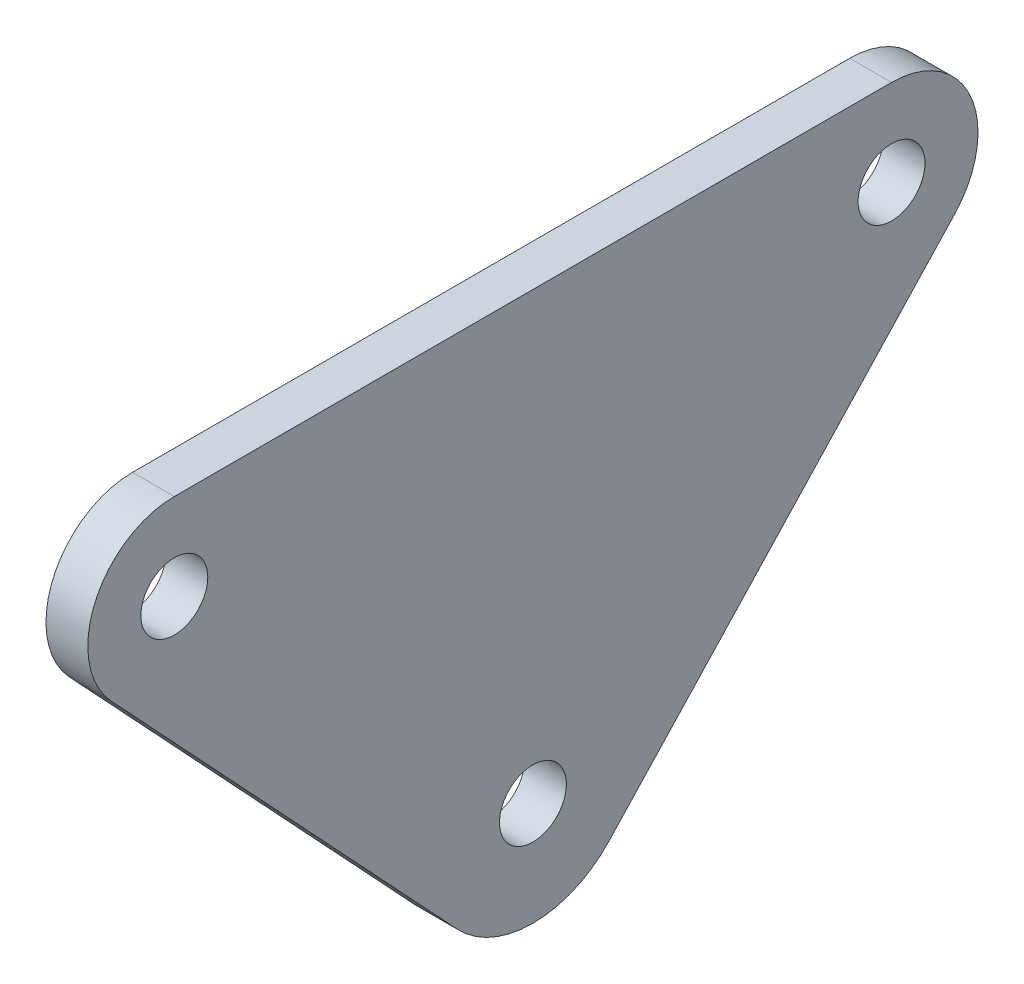
ISO-10303-21;
HEADER;
FILE_DESCRIPTION(('STEP AP214'),'2;1');
FILE_NAME('part.step','',(''),(''),'','','');
FILE_SCHEMA(('AUTOMOTIVE_DESIGN { 1 0 10303 214 1 1 1 1 }'));
ENDSEC;
DATA;
#1=APPLICATION_CONTEXT('core data for automotive mechanical design processes');
#2=APPLICATION_PROTOCOL_DEFINITION('international standard','automotive_design',2000,#1);
#3=PRODUCT_CONTEXT('',#1,'mechanical');
#4=PRODUCT('Part','Part','',(#3));
#5=PRODUCT_RELATED_PRODUCT_CATEGORY('part','',(#4));
#6=PRODUCT_DEFINITION_FORMATION('','',#4);
#7=PRODUCT_DEFINITION_CONTEXT('part definition',#1,'design');
#8=PRODUCT_DEFINITION('design','',#6,#7);
#9=PRODUCT_DEFINITION_SHAPE('','',#8);
#10=(LENGTH_UNIT() NAMED_UNIT(*) SI_UNIT(.MILLI.,.METRE.));
#11=(NAMED_UNIT(*) PLANE_ANGLE_UNIT() SI_UNIT($,.RADIAN.));
#12=(NAMED_UNIT(*) SI_UNIT($,.STERADIAN.) SOLID_ANGLE_UNIT());
#13=UNCERTAINTY_MEASURE_WITH_UNIT(LENGTH_MEASURE(1.E-05),#10,'distance_accuracy_value','');
#14=(GEOMETRIC_REPRESENTATION_CONTEXT(3) GLOBAL_UNCERTAINTY_ASSIGNED_CONTEXT((#13)) GLOBAL_UNIT_ASSIGNED_CONTEXT((#10,
#11,#12)) REPRESENTATION_CONTEXT('',''));
#15=CARTESIAN_POINT('',(0.,0.,0.));
#16=DIRECTION('',(0.,0.,1.));
#17=DIRECTION('',(1.,0.,0.));
#18=AXIS2_PLACEMENT_3D('',#15,#16,#17);
#19=CARTESIAN_POINT('',(4.445,38.1,38.1));
#20=DIRECTION('',(1.,0.,0.));
#21=DIRECTION('',(0.,0.,-1.));
#22=AXIS2_PLACEMENT_3D('',#19,#20,#21);
#23=PLANE('',#22);
#24=CARTESIAN_POINT('',(4.445,0.,0.));
#25=DIRECTION('',(1.,0.,0.));
#26=DIRECTION('',(0.,0.,-1.));
#27=AXIS2_PLACEMENT_3D('',#24,#25,#26);
#28=CIRCLE('',#27,3.556);
#29=CARTESIAN_POINT('',(4.445,0.,-3.556));
#30=VERTEX_POINT('',#29);
#31=EDGE_CURVE('E215',#30,#30,#28,.T.);
#32=ORIENTED_EDGE('',*,*,#31,.F.);
#33=EDGE_LOOP('',(#32));
#34=FACE_BOUND('',#33,.T.);
#35=CARTESIAN_POINT('',(4.445,38.1,38.1));
#36=DIRECTION('',(1.,0.,0.));
#37=DIRECTION('',(0.,0.,-1.));
#38=AXIS2_PLACEMENT_3D('',#35,#36,#37);
#39=CIRCLE('',#38,9.18880564338449);
#40=CARTESIAN_POINT('',(4.445,47.2888056433845,38.1));
#41=VERTEX_POINT('',#40);
#42=CARTESIAN_POINT('',(4.445,31.8284133518365,44.8157538717907));
#43=VERTEX_POINT('',#42);
#44=EDGE_CURVE('E154',#41,#43,#39,.T.);
#45=ORIENTED_EDGE('',*,*,#44,.T.);
#46=DIRECTION('',(0.,-0.730862544320514,-0.682524681831613));
#47=VECTOR('',#46,1.);
#48=CARTESIAN_POINT('',(4.445,-7.52857362678007,8.06176336540207));
#49=LINE('',#48,#47);
#50=CARTESIAN_POINT('',(4.445,-7.52857362678007,8.06176336540207));
#51=VERTEX_POINT('',#50);
#52=EDGE_CURVE('E102',#43,#51,#49,.T.);
#53=ORIENTED_EDGE('',*,*,#52,.T.);
#54=CARTESIAN_POINT('',(4.445,0.,0.));
#55=DIRECTION('',(1.,0.,0.));
#56=DIRECTION('',(0.,0.,1.));
#57=AXIS2_PLACEMENT_3D('',#54,#55,#56);
#58=CIRCLE('',#57,11.0304782042116);
#59=CARTESIAN_POINT('',(4.445,-7.52857362678006,-8.06176336540207));
#60=VERTEX_POINT('',#59);
#61=EDGE_CURVE('E115',#51,#60,#58,.T.);
#62=ORIENTED_EDGE('',*,*,#61,.T.);
#63=DIRECTION('',(0.,0.730862544320514,-0.682524681831613));
#64=VECTOR('',#63,1.);
#65=CARTESIAN_POINT('',(4.445,31.8284133518365,-44.8157538717907));
#66=LINE('',#65,#64);
#67=CARTESIAN_POINT('',(4.445,31.8284133518365,-44.8157538717907));
#68=VERTEX_POINT('',#67);
#69=EDGE_CURVE('E109',#60,#68,#66,.T.);
#70=ORIENTED_EDGE('',*,*,#69,.T.);
#71=CARTESIAN_POINT('',(4.445,38.1,-38.1));
#72=DIRECTION('',(1.,0.,0.));
#73=DIRECTION('',(0.,0.,1.));
#74=AXIS2_PLACEMENT_3D('',#71,#72,#73);
#75=CIRCLE('',#74,9.18880564338449);
#76=CARTESIAN_POINT('',(4.445,47.2888056433845,-38.1));
#77=VERTEX_POINT('',#76);
#78=EDGE_CURVE('E113',#68,#77,#75,.T.);
#79=ORIENTED_EDGE('',*,*,#78,.T.);
#80=DIRECTION('',(0.,0.,1.));
#81=VECTOR('',#80,1.);
#82=CARTESIAN_POINT('',(4.445,47.2888056433845,38.1));
#83=LINE('',#82,#81);
#84=EDGE_CURVE('E65',#77,#41,#83,.T.);
#85=ORIENTED_EDGE('',*,*,#84,.T.);
#86=EDGE_LOOP('',(#45,#53,#62,#70,#79,#85));
#87=FACE_BOUND('',#86,.T.);
#88=CARTESIAN_POINT('',(4.445,38.1,38.1));
#89=DIRECTION('',(1.,0.,0.));
#90=DIRECTION('',(0.,0.,-1.));
#91=AXIS2_PLACEMENT_3D('',#88,#89,#90);
#92=CIRCLE('',#91,3.556);
#93=CARTESIAN_POINT('',(4.445,38.1,34.544));
#94=VERTEX_POINT('',#93);
#95=EDGE_CURVE('E142',#94,#94,#92,.T.);
#96=ORIENTED_EDGE('',*,*,#95,.F.);
#97=EDGE_LOOP('',(#96));
#98=FACE_BOUND('',#97,.T.);
#99=CARTESIAN_POINT('',(4.445,38.1,-38.1));
#100=DIRECTION('',(1.,0.,0.));
#101=DIRECTION('',(0.,0.,-1.));
#102=AXIS2_PLACEMENT_3D('',#99,#100,#101);
#103=CIRCLE('',#102,3.556);
#104=CARTESIAN_POINT('',(4.445,38.1,-41.656));
#105=VERTEX_POINT('',#104);
#106=EDGE_CURVE('E204',#105,#105,#103,.T.);
#107=ORIENTED_EDGE('',*,*,#106,.F.);
#108=EDGE_LOOP('',(#107));
#109=FACE_BOUND('',#108,.T.);
#110=ADVANCED_FACE('F47',(#34,#87,#98,#109),#23,.T.);
#111=CARTESIAN_POINT('',(0.,38.1,38.1));
#112=DIRECTION('',(1.,0.,0.));
#113=DIRECTION('',(0.,0.,-1.));
#114=AXIS2_PLACEMENT_3D('',#111,#112,#113);
#115=PLANE('',#114);
#116=CARTESIAN_POINT('',(0.,38.1,38.1));
#117=DIRECTION('',(1.,0.,0.));
#118=DIRECTION('',(0.,0.,-1.));
#119=AXIS2_PLACEMENT_3D('',#116,#117,#118);
#120=CIRCLE('',#119,9.18880564338449);
#121=CARTESIAN_POINT('',(0.,47.2888056433845,38.1));
#122=VERTEX_POINT('',#121);
#123=CARTESIAN_POINT('',(0.,31.8284133518365,44.8157538717907));
#124=VERTEX_POINT('',#123);
#125=EDGE_CURVE('E137',#122,#124,#120,.T.);
#126=ORIENTED_EDGE('',*,*,#125,.F.);
#127=DIRECTION('',(0.,0.,1.));
#128=VECTOR('',#127,1.);
#129=CARTESIAN_POINT('',(0.,47.2888056433845,38.1));
#130=LINE('',#129,#128);
#131=CARTESIAN_POINT('',(0.,47.2888056433845,-38.1));
#132=VERTEX_POINT('',#131);
#133=EDGE_CURVE('E94',#132,#122,#130,.T.);
#134=ORIENTED_EDGE('',*,*,#133,.F.);
#135=CARTESIAN_POINT('',(0.,38.1,-38.1));
#136=DIRECTION('',(1.,0.,0.));
#137=DIRECTION('',(0.,0.,1.));
#138=AXIS2_PLACEMENT_3D('',#135,#136,#137);
#139=CIRCLE('',#138,9.18880564338449);
#140=CARTESIAN_POINT('',(0.,31.8284133518365,-44.8157538717907));
#141=VERTEX_POINT('',#140);
#142=EDGE_CURVE('E88',#141,#132,#139,.T.);
#143=ORIENTED_EDGE('',*,*,#142,.F.);
#144=DIRECTION('',(0.,0.730862544320514,-0.682524681831613));
#145=VECTOR('',#144,1.);
#146=CARTESIAN_POINT('',(0.,31.8284133518365,-44.8157538717907));
#147=LINE('',#146,#145);
#148=CARTESIAN_POINT('',(0.,-7.52857362678006,-8.06176336540207));
#149=VERTEX_POINT('',#148);
#150=EDGE_CURVE('E124',#149,#141,#147,.T.);
#151=ORIENTED_EDGE('',*,*,#150,.F.);
#152=CARTESIAN_POINT('',(0.,0.,0.));
#153=DIRECTION('',(1.,0.,0.));
#154=DIRECTION('',(0.,0.,1.));
#155=AXIS2_PLACEMENT_3D('',#152,#153,#154);
#156=CIRCLE('',#155,11.0304782042116);
#157=CARTESIAN_POINT('',(0.,-7.52857362678007,8.06176336540207));
#158=VERTEX_POINT('',#157);
#159=EDGE_CURVE('E145',#158,#149,#156,.T.);
#160=ORIENTED_EDGE('',*,*,#159,.F.);
#161=DIRECTION('',(0.,-0.730862544320514,-0.682524681831613));
#162=VECTOR('',#161,1.);
#163=CARTESIAN_POINT('',(0.,-7.52857362678007,8.06176336540207));
#164=LINE('',#163,#162);
#165=EDGE_CURVE('E141',#124,#158,#164,.T.);
#166=ORIENTED_EDGE('',*,*,#165,.F.);
#167=EDGE_LOOP('',(#126,#134,#143,#151,#160,#166));
#168=FACE_BOUND('',#167,.T.);
#169=CARTESIAN_POINT('',(0.,38.1,38.1));
#170=DIRECTION('',(1.,0.,0.));
#171=DIRECTION('',(0.,0.,-1.));
#172=AXIS2_PLACEMENT_3D('',#169,#170,#171);
#173=CIRCLE('',#172,3.556);
#174=CARTESIAN_POINT('',(0.,38.1,34.544));
#175=VERTEX_POINT('',#174);
#176=EDGE_CURVE('E219',#175,#175,#173,.T.);
#177=ORIENTED_EDGE('',*,*,#176,.T.);
#178=EDGE_LOOP('',(#177));
#179=FACE_BOUND('',#178,.T.);
#180=CARTESIAN_POINT('',(0.,0.,0.));
#181=DIRECTION('',(1.,0.,0.));
#182=DIRECTION('',(0.,0.,-1.));
#183=AXIS2_PLACEMENT_3D('',#180,#181,#182);
#184=CIRCLE('',#183,3.556);
#185=CARTESIAN_POINT('',(0.,0.,-3.556));
#186=VERTEX_POINT('',#185);
#187=EDGE_CURVE('E212',#186,#186,#184,.T.);
#188=ORIENTED_EDGE('',*,*,#187,.T.);
#189=EDGE_LOOP('',(#188));
#190=FACE_BOUND('',#189,.T.);
#191=CARTESIAN_POINT('',(0.,38.1,-38.1));
#192=DIRECTION('',(1.,0.,0.));
#193=DIRECTION('',(0.,0.,-1.));
#194=AXIS2_PLACEMENT_3D('',#191,#192,#193);
#195=CIRCLE('',#194,3.556);
#196=CARTESIAN_POINT('',(0.,38.1,-41.656));
#197=VERTEX_POINT('',#196);
#198=EDGE_CURVE('E207',#197,#197,#195,.T.);
#199=ORIENTED_EDGE('',*,*,#198,.T.);
#200=EDGE_LOOP('',(#199));
#201=FACE_BOUND('',#200,.T.);
#202=ADVANCED_FACE('F167',(#168,#179,#190,#201),#115,.F.);
#203=CARTESIAN_POINT('',(4.445,38.1,38.1));
#204=DIRECTION('',(-1.,0.,0.));
#205=DIRECTION('',(0.,0.,1.));
#206=AXIS2_PLACEMENT_3D('',#203,#204,#205);
#207=CYLINDRICAL_SURFACE('',#206,9.18880564338449);
#208=ORIENTED_EDGE('',*,*,#125,.T.);
#209=DIRECTION('',(-1.,0.,0.));
#210=VECTOR('',#209,1.);
#211=CARTESIAN_POINT('',(4.445,31.8284133518365,44.8157538717907));
#212=LINE('',#211,#210);
#213=EDGE_CURVE('E11',#43,#124,#212,.T.);
#214=ORIENTED_EDGE('',*,*,#213,.F.);
#215=ORIENTED_EDGE('',*,*,#44,.F.);
#216=DIRECTION('',(-1.,0.,0.));
#217=VECTOR('',#216,1.);
#218=CARTESIAN_POINT('',(4.445,47.2888056433845,38.1));
#219=LINE('',#218,#217);
#220=EDGE_CURVE('E133',#41,#122,#219,.T.);
#221=ORIENTED_EDGE('',*,*,#220,.T.);
#222=EDGE_LOOP('',(#208,#214,#215,#221));
#223=FACE_BOUND('',#222,.T.);
#224=ADVANCED_FACE('F49',(#223),#207,.T.);
#225=CARTESIAN_POINT('',(4.445,-7.52857362678007,8.06176336540207));
#226=DIRECTION('',(0.,0.682524681831613,-0.730862544320514));
#227=DIRECTION('',(0.,0.730862544320514,0.682524681831613));
#228=AXIS2_PLACEMENT_3D('',#225,#226,#227);
#229=PLANE('',#228);
#230=ORIENTED_EDGE('',*,*,#165,.T.);
#231=DIRECTION('',(-1.,0.,0.));
#232=VECTOR('',#231,1.);
#233=CARTESIAN_POINT('',(4.445,-7.52857362678007,8.06176336540207));
#234=LINE('',#233,#232);
#235=EDGE_CURVE('E57',#51,#158,#234,.T.);
#236=ORIENTED_EDGE('',*,*,#235,.F.);
#237=ORIENTED_EDGE('',*,*,#52,.F.);
#238=ORIENTED_EDGE('',*,*,#213,.T.);
#239=EDGE_LOOP('',(#230,#236,#237,#238));
#240=FACE_BOUND('',#239,.T.);
#241=ADVANCED_FACE('F278',(#240),#229,.F.);
#242=CARTESIAN_POINT('',(4.445,0.,0.));
#243=DIRECTION('',(-1.,0.,0.));
#244=DIRECTION('',(0.,0.,1.));
#245=AXIS2_PLACEMENT_3D('',#242,#243,#244);
#246=CYLINDRICAL_SURFACE('',#245,11.0304782042116);
#247=ORIENTED_EDGE('',*,*,#159,.T.);
#248=DIRECTION('',(-1.,0.,0.));
#249=VECTOR('',#248,1.);
#250=CARTESIAN_POINT('',(4.445,-7.52857362678006,-8.06176336540207));
#251=LINE('',#250,#249);
#252=EDGE_CURVE('E126',#60,#149,#251,.T.);
#253=ORIENTED_EDGE('',*,*,#252,.F.);
#254=ORIENTED_EDGE('',*,*,#61,.F.);
#255=ORIENTED_EDGE('',*,*,#235,.T.);
#256=EDGE_LOOP('',(#247,#253,#254,#255));
#257=FACE_BOUND('',#256,.T.);
#258=ADVANCED_FACE('F164',(#257),#246,.T.);
#259=CARTESIAN_POINT('',(4.445,31.8284133518365,-44.8157538717907));
#260=DIRECTION('',(0.,0.682524681831613,0.730862544320514));
#261=DIRECTION('',(0.,-0.730862544320514,0.682524681831613));
#262=AXIS2_PLACEMENT_3D('',#259,#260,#261);
#263=PLANE('',#262);
#264=ORIENTED_EDGE('',*,*,#150,.T.);
#265=DIRECTION('',(-1.,0.,0.));
#266=VECTOR('',#265,1.);
#267=CARTESIAN_POINT('',(4.445,31.8284133518365,-44.8157538717907));
#268=LINE('',#267,#266);
#269=EDGE_CURVE('E121',#68,#141,#268,.T.);
#270=ORIENTED_EDGE('',*,*,#269,.F.);
#271=ORIENTED_EDGE('',*,*,#69,.F.);
#272=ORIENTED_EDGE('',*,*,#252,.T.);
#273=EDGE_LOOP('',(#264,#270,#271,#272));
#274=FACE_BOUND('',#273,.T.);
#275=ADVANCED_FACE('F122',(#274),#263,.F.);
#276=CARTESIAN_POINT('',(4.445,38.1,-38.1));
#277=DIRECTION('',(-1.,0.,0.));
#278=DIRECTION('',(0.,0.,1.));
#279=AXIS2_PLACEMENT_3D('',#276,#277,#278);
#280=CYLINDRICAL_SURFACE('',#279,9.18880564338449);
#281=ORIENTED_EDGE('',*,*,#142,.T.);
#282=DIRECTION('',(-1.,0.,0.));
#283=VECTOR('',#282,1.);
#284=CARTESIAN_POINT('',(4.445,47.2888056433845,-38.1));
#285=LINE('',#284,#283);
#286=EDGE_CURVE('E127',#77,#132,#285,.T.);
#287=ORIENTED_EDGE('',*,*,#286,.F.);
#288=ORIENTED_EDGE('',*,*,#78,.F.);
#289=ORIENTED_EDGE('',*,*,#269,.T.);
#290=EDGE_LOOP('',(#281,#287,#288,#289));
#291=FACE_BOUND('',#290,.T.);
#292=ADVANCED_FACE('F129',(#291),#280,.T.);
#293=CARTESIAN_POINT('',(4.445,47.2888056433845,38.1));
#294=DIRECTION('',(0.,-1.,0.));
#295=DIRECTION('',(0.,0.,-1.));
#296=AXIS2_PLACEMENT_3D('',#293,#294,#295);
#297=PLANE('',#296);
#298=ORIENTED_EDGE('',*,*,#133,.T.);
#299=ORIENTED_EDGE('',*,*,#220,.F.);
#300=ORIENTED_EDGE('',*,*,#84,.F.);
#301=ORIENTED_EDGE('',*,*,#286,.T.);
#302=EDGE_LOOP('',(#298,#299,#300,#301));
#303=FACE_BOUND('',#302,.T.);
#304=ADVANCED_FACE('F172',(#303),#297,.F.);
#305=CARTESIAN_POINT('',(4.445,38.1,38.1));
#306=DIRECTION('',(-1.,0.,0.));
#307=DIRECTION('',(0.,0.,1.));
#308=AXIS2_PLACEMENT_3D('',#305,#306,#307);
#309=CYLINDRICAL_SURFACE('',#308,3.556);
#310=ORIENTED_EDGE('',*,*,#95,.T.);
#311=EDGE_LOOP('',(#310));
#312=FACE_BOUND('',#311,.T.);
#313=ORIENTED_EDGE('',*,*,#176,.F.);
#314=EDGE_LOOP('',(#313));
#315=FACE_BOUND('',#314,.T.);
#316=ADVANCED_FACE('F174',(#312,#315),#309,.F.);
#317=CARTESIAN_POINT('',(4.445,0.,0.));
#318=DIRECTION('',(-1.,0.,0.));
#319=DIRECTION('',(0.,0.,1.));
#320=AXIS2_PLACEMENT_3D('',#317,#318,#319);
#321=CYLINDRICAL_SURFACE('',#320,3.556);
#322=ORIENTED_EDGE('',*,*,#31,.T.);
#323=EDGE_LOOP('',(#322));
#324=FACE_BOUND('',#323,.T.);
#325=ORIENTED_EDGE('',*,*,#187,.F.);
#326=EDGE_LOOP('',(#325));
#327=FACE_BOUND('',#326,.T.);
#328=ADVANCED_FACE('F180',(#324,#327),#321,.F.);
#329=CARTESIAN_POINT('',(4.445,38.1,-38.1));
#330=DIRECTION('',(-1.,0.,0.));
#331=DIRECTION('',(0.,0.,1.));
#332=AXIS2_PLACEMENT_3D('',#329,#330,#331);
#333=CYLINDRICAL_SURFACE('',#332,3.556);
#334=ORIENTED_EDGE('',*,*,#106,.T.);
#335=EDGE_LOOP('',(#334));
#336=FACE_BOUND('',#335,.T.);
#337=ORIENTED_EDGE('',*,*,#198,.F.);
#338=EDGE_LOOP('',(#337));
#339=FACE_BOUND('',#338,.T.);
#340=ADVANCED_FACE('F195',(#336,#339),#333,.F.);
#341=CLOSED_SHELL('',(#110,#202,#224,#241,#258,#275,#292,#304,#316,#328,#340));
#342=MANIFOLD_SOLID_BREP('B2',#341);
#343=ADVANCED_BREP_SHAPE_REPRESENTATION('',(#18,#342),#14);
#344=SHAPE_DEFINITION_REPRESENTATION(#9,#343);
ENDSEC;
END-ISO-10303-21;
